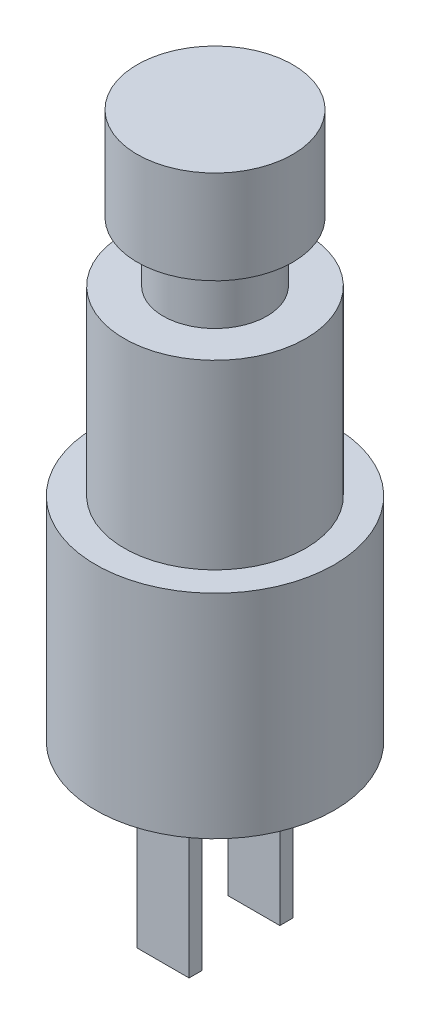
ISO-10303-21;
HEADER;
FILE_DESCRIPTION(('STEP AP214'),'2;1');
FILE_NAME('part.step','',(''),(''),'','','');
FILE_SCHEMA(('AUTOMOTIVE_DESIGN { 1 0 10303 214 1 1 1 1 }'));
ENDSEC;
DATA;
#1=APPLICATION_CONTEXT('core data for automotive mechanical design processes');
#2=APPLICATION_PROTOCOL_DEFINITION('international standard','automotive_design',2000,#1);
#3=PRODUCT_CONTEXT('',#1,'mechanical');
#4=PRODUCT('Part','Part','',(#3));
#5=PRODUCT_RELATED_PRODUCT_CATEGORY('part','',(#4));
#6=PRODUCT_DEFINITION_FORMATION('','',#4);
#7=PRODUCT_DEFINITION_CONTEXT('part definition',#1,'design');
#8=PRODUCT_DEFINITION('design','',#6,#7);
#9=PRODUCT_DEFINITION_SHAPE('','',#8);
#10=(LENGTH_UNIT() NAMED_UNIT(*) SI_UNIT(.MILLI.,.METRE.));
#11=(NAMED_UNIT(*) PLANE_ANGLE_UNIT() SI_UNIT($,.RADIAN.));
#12=(NAMED_UNIT(*) SI_UNIT($,.STERADIAN.) SOLID_ANGLE_UNIT());
#13=UNCERTAINTY_MEASURE_WITH_UNIT(LENGTH_MEASURE(1.E-05),#10,'distance_accuracy_value','');
#14=(GEOMETRIC_REPRESENTATION_CONTEXT(3) GLOBAL_UNCERTAINTY_ASSIGNED_CONTEXT((#13)) GLOBAL_UNIT_ASSIGNED_CONTEXT((#10,
#11,#12)) REPRESENTATION_CONTEXT('',''));
#15=CARTESIAN_POINT('',(0.,0.,0.));
#16=DIRECTION('',(0.,0.,1.));
#17=DIRECTION('',(1.,0.,0.));
#18=AXIS2_PLACEMENT_3D('',#15,#16,#17);
#19=CARTESIAN_POINT('',(4.6,0.,0.));
#20=DIRECTION('',(0.,-1.,0.));
#21=DIRECTION('',(1.,0.,0.));
#22=AXIS2_PLACEMENT_3D('',#19,#20,#21);
#23=PLANE('',#22);
#24=CARTESIAN_POINT('',(0.,0.,0.));
#25=DIRECTION('',(0.,-1.,0.));
#26=DIRECTION('',(1.,0.,0.));
#27=AXIS2_PLACEMENT_3D('',#24,#25,#26);
#28=CIRCLE('',#27,4.6);
#29=CARTESIAN_POINT('',(4.6,0.,0.));
#30=VERTEX_POINT('',#29);
#31=EDGE_CURVE('E156',#30,#30,#28,.T.);
#32=ORIENTED_EDGE('',*,*,#31,.T.);
#33=EDGE_LOOP('',(#32));
#34=FACE_BOUND('',#33,.T.);
#35=DIRECTION('',(0.,0.,1.));
#36=VECTOR('',#35,1.);
#37=CARTESIAN_POINT('',(0.999999999999999,0.,2.));
#38=LINE('',#37,#36);
#39=CARTESIAN_POINT('',(0.999999999999999,0.,1.5));
#40=VERTEX_POINT('',#39);
#41=CARTESIAN_POINT('',(0.999999999999999,0.,2.));
#42=VERTEX_POINT('',#41);
#43=EDGE_CURVE('E128',#40,#42,#38,.T.);
#44=ORIENTED_EDGE('',*,*,#43,.F.);
#45=DIRECTION('',(1.,0.,0.));
#46=VECTOR('',#45,1.);
#47=CARTESIAN_POINT('',(0.999999999999999,0.,1.5));
#48=LINE('',#47,#46);
#49=CARTESIAN_POINT('',(-1.,0.,1.5));
#50=VERTEX_POINT('',#49);
#51=EDGE_CURVE('E125',#50,#40,#48,.T.);
#52=ORIENTED_EDGE('',*,*,#51,.F.);
#53=DIRECTION('',(0.,0.,-1.));
#54=VECTOR('',#53,1.);
#55=CARTESIAN_POINT('',(-1.,0.,1.5));
#56=LINE('',#55,#54);
#57=CARTESIAN_POINT('',(-1.,0.,2.));
#58=VERTEX_POINT('',#57);
#59=EDGE_CURVE('E137',#58,#50,#56,.T.);
#60=ORIENTED_EDGE('',*,*,#59,.F.);
#61=DIRECTION('',(-1.,0.,0.));
#62=VECTOR('',#61,1.);
#63=CARTESIAN_POINT('',(-1.,0.,2.));
#64=LINE('',#63,#62);
#65=EDGE_CURVE('E145',#42,#58,#64,.T.);
#66=ORIENTED_EDGE('',*,*,#65,.F.);
#67=EDGE_LOOP('',(#44,#52,#60,#66));
#68=FACE_BOUND('',#67,.T.);
#69=DIRECTION('',(-1.,0.,0.));
#70=VECTOR('',#69,1.);
#71=CARTESIAN_POINT('',(1.,0.,-1.5));
#72=LINE('',#71,#70);
#73=CARTESIAN_POINT('',(1.,0.,-1.5));
#74=VERTEX_POINT('',#73);
#75=CARTESIAN_POINT('',(-1.,0.,-1.5));
#76=VERTEX_POINT('',#75);
#77=EDGE_CURVE('E202',#74,#76,#72,.T.);
#78=ORIENTED_EDGE('',*,*,#77,.F.);
#79=DIRECTION('',(0.,0.,1.));
#80=VECTOR('',#79,1.);
#81=CARTESIAN_POINT('',(0.999999999999999,0.,-2.));
#82=LINE('',#81,#80);
#83=CARTESIAN_POINT('',(0.999999999999999,0.,-2.));
#84=VERTEX_POINT('',#83);
#85=EDGE_CURVE('E123',#84,#74,#82,.T.);
#86=ORIENTED_EDGE('',*,*,#85,.F.);
#87=DIRECTION('',(1.,0.,0.));
#88=VECTOR('',#87,1.);
#89=CARTESIAN_POINT('',(-1.,0.,-2.));
#90=LINE('',#89,#88);
#91=CARTESIAN_POINT('',(-1.,0.,-2.));
#92=VERTEX_POINT('',#91);
#93=EDGE_CURVE('E119',#92,#84,#90,.T.);
#94=ORIENTED_EDGE('',*,*,#93,.F.);
#95=DIRECTION('',(0.,0.,-1.));
#96=VECTOR('',#95,1.);
#97=CARTESIAN_POINT('',(-1.,0.,-1.5));
#98=LINE('',#97,#96);
#99=EDGE_CURVE('E204',#76,#92,#98,.T.);
#100=ORIENTED_EDGE('',*,*,#99,.F.);
#101=EDGE_LOOP('',(#78,#86,#94,#100));
#102=FACE_BOUND('',#101,.T.);
#103=ADVANCED_FACE('F35',(#34,#68,#102),#23,.T.);
#104=CARTESIAN_POINT('',(0.,21.1,0.));
#105=DIRECTION('',(0.,1.,0.));
#106=DIRECTION('',(-1.,0.,0.));
#107=AXIS2_PLACEMENT_3D('',#104,#105,#106);
#108=PLANE('',#107);
#109=CARTESIAN_POINT('',(0.,21.1,0.));
#110=DIRECTION('',(0.,-1.,0.));
#111=DIRECTION('',(1.,0.,0.));
#112=AXIS2_PLACEMENT_3D('',#109,#110,#111);
#113=CIRCLE('',#112,3.);
#114=CARTESIAN_POINT('',(3.,21.1,0.));
#115=VERTEX_POINT('',#114);
#116=EDGE_CURVE('E11',#115,#115,#113,.T.);
#117=ORIENTED_EDGE('',*,*,#116,.F.);
#118=EDGE_LOOP('',(#117));
#119=FACE_BOUND('',#118,.T.);
#120=ADVANCED_FACE('F181',(#119),#108,.T.);
#121=CARTESIAN_POINT('',(0.,0.,0.));
#122=DIRECTION('',(0.,-1.,0.));
#123=DIRECTION('',(1.,0.,0.));
#124=AXIS2_PLACEMENT_3D('',#121,#122,#123);
#125=CYLINDRICAL_SURFACE('',#124,3.);
#126=ORIENTED_EDGE('',*,*,#116,.T.);
#127=EDGE_LOOP('',(#126));
#128=FACE_BOUND('',#127,.T.);
#129=CARTESIAN_POINT('',(0.,17.5,0.));
#130=DIRECTION('',(0.,-1.,0.));
#131=DIRECTION('',(1.,0.,0.));
#132=AXIS2_PLACEMENT_3D('',#129,#130,#131);
#133=CIRCLE('',#132,3.);
#134=CARTESIAN_POINT('',(3.,17.5,0.));
#135=VERTEX_POINT('',#134);
#136=EDGE_CURVE('E42',#135,#135,#133,.T.);
#137=ORIENTED_EDGE('',*,*,#136,.F.);
#138=EDGE_LOOP('',(#137));
#139=FACE_BOUND('',#138,.T.);
#140=ADVANCED_FACE('F179',(#128,#139),#125,.T.);
#141=CARTESIAN_POINT('',(3.,17.5,0.));
#142=DIRECTION('',(0.,-1.,0.));
#143=DIRECTION('',(1.,0.,0.));
#144=AXIS2_PLACEMENT_3D('',#141,#142,#143);
#145=PLANE('',#144);
#146=ORIENTED_EDGE('',*,*,#136,.T.);
#147=EDGE_LOOP('',(#146));
#148=FACE_BOUND('',#147,.T.);
#149=CARTESIAN_POINT('',(0.,17.5,0.));
#150=DIRECTION('',(0.,-1.,0.));
#151=DIRECTION('',(1.,0.,0.));
#152=AXIS2_PLACEMENT_3D('',#149,#150,#151);
#153=CIRCLE('',#152,2.);
#154=CARTESIAN_POINT('',(2.,17.5,0.));
#155=VERTEX_POINT('',#154);
#156=EDGE_CURVE('E171',#155,#155,#153,.T.);
#157=ORIENTED_EDGE('',*,*,#156,.F.);
#158=EDGE_LOOP('',(#157));
#159=FACE_BOUND('',#158,.T.);
#160=ADVANCED_FACE('F176',(#148,#159),#145,.T.);
#161=CARTESIAN_POINT('',(0.,0.,0.));
#162=DIRECTION('',(0.,-1.,0.));
#163=DIRECTION('',(1.,0.,0.));
#164=AXIS2_PLACEMENT_3D('',#161,#162,#163);
#165=CYLINDRICAL_SURFACE('',#164,2.);
#166=ORIENTED_EDGE('',*,*,#156,.T.);
#167=EDGE_LOOP('',(#166));
#168=FACE_BOUND('',#167,.T.);
#169=CARTESIAN_POINT('',(0.,15.2,0.));
#170=DIRECTION('',(0.,-1.,0.));
#171=DIRECTION('',(1.,0.,0.));
#172=AXIS2_PLACEMENT_3D('',#169,#170,#171);
#173=CIRCLE('',#172,2.);
#174=CARTESIAN_POINT('',(2.,15.2,0.));
#175=VERTEX_POINT('',#174);
#176=EDGE_CURVE('E168',#175,#175,#173,.T.);
#177=ORIENTED_EDGE('',*,*,#176,.F.);
#178=EDGE_LOOP('',(#177));
#179=FACE_BOUND('',#178,.T.);
#180=ADVANCED_FACE('F188',(#168,#179),#165,.T.);
#181=CARTESIAN_POINT('',(2.,15.2,0.));
#182=DIRECTION('',(0.,1.,0.));
#183=DIRECTION('',(-1.,0.,0.));
#184=AXIS2_PLACEMENT_3D('',#181,#182,#183);
#185=PLANE('',#184);
#186=ORIENTED_EDGE('',*,*,#176,.T.);
#187=EDGE_LOOP('',(#186));
#188=FACE_BOUND('',#187,.T.);
#189=CARTESIAN_POINT('',(0.,15.2,0.));
#190=DIRECTION('',(0.,-1.,0.));
#191=DIRECTION('',(1.,0.,0.));
#192=AXIS2_PLACEMENT_3D('',#189,#190,#191);
#193=CIRCLE('',#192,3.5);
#194=CARTESIAN_POINT('',(3.5,15.2,0.));
#195=VERTEX_POINT('',#194);
#196=EDGE_CURVE('E165',#195,#195,#193,.T.);
#197=ORIENTED_EDGE('',*,*,#196,.F.);
#198=EDGE_LOOP('',(#197));
#199=FACE_BOUND('',#198,.T.);
#200=ADVANCED_FACE('F259',(#188,#199),#185,.T.);
#201=CARTESIAN_POINT('',(0.,0.,0.));
#202=DIRECTION('',(0.,-1.,0.));
#203=DIRECTION('',(1.,0.,0.));
#204=AXIS2_PLACEMENT_3D('',#201,#202,#203);
#205=CYLINDRICAL_SURFACE('',#204,3.5);
#206=ORIENTED_EDGE('',*,*,#196,.T.);
#207=EDGE_LOOP('',(#206));
#208=FACE_BOUND('',#207,.T.);
#209=CARTESIAN_POINT('',(0.,8.2,0.));
#210=DIRECTION('',(0.,-1.,0.));
#211=DIRECTION('',(1.,0.,0.));
#212=AXIS2_PLACEMENT_3D('',#209,#210,#211);
#213=CIRCLE('',#212,3.5);
#214=CARTESIAN_POINT('',(3.5,8.2,0.));
#215=VERTEX_POINT('',#214);
#216=EDGE_CURVE('E162',#215,#215,#213,.T.);
#217=ORIENTED_EDGE('',*,*,#216,.F.);
#218=EDGE_LOOP('',(#217));
#219=FACE_BOUND('',#218,.T.);
#220=ADVANCED_FACE('F255',(#208,#219),#205,.T.);
#221=CARTESIAN_POINT('',(3.5,8.2,0.));
#222=DIRECTION('',(0.,1.,0.));
#223=DIRECTION('',(-1.,0.,0.));
#224=AXIS2_PLACEMENT_3D('',#221,#222,#223);
#225=PLANE('',#224);
#226=ORIENTED_EDGE('',*,*,#216,.T.);
#227=EDGE_LOOP('',(#226));
#228=FACE_BOUND('',#227,.T.);
#229=CARTESIAN_POINT('',(0.,8.2,0.));
#230=DIRECTION('',(0.,-1.,0.));
#231=DIRECTION('',(1.,0.,0.));
#232=AXIS2_PLACEMENT_3D('',#229,#230,#231);
#233=CIRCLE('',#232,4.6);
#234=CARTESIAN_POINT('',(4.6,8.2,0.));
#235=VERTEX_POINT('',#234);
#236=EDGE_CURVE('E159',#235,#235,#233,.T.);
#237=ORIENTED_EDGE('',*,*,#236,.F.);
#238=EDGE_LOOP('',(#237));
#239=FACE_BOUND('',#238,.T.);
#240=ADVANCED_FACE('F251',(#228,#239),#225,.T.);
#241=CARTESIAN_POINT('',(0.,0.,0.));
#242=DIRECTION('',(0.,-1.,0.));
#243=DIRECTION('',(1.,0.,0.));
#244=AXIS2_PLACEMENT_3D('',#241,#242,#243);
#245=CYLINDRICAL_SURFACE('',#244,4.6);
#246=ORIENTED_EDGE('',*,*,#236,.T.);
#247=EDGE_LOOP('',(#246));
#248=FACE_BOUND('',#247,.T.);
#249=ORIENTED_EDGE('',*,*,#31,.F.);
#250=EDGE_LOOP('',(#249));
#251=FACE_BOUND('',#250,.T.);
#252=ADVANCED_FACE('F247',(#248,#251),#245,.T.);
#253=CARTESIAN_POINT('',(0.999999999999999,-6.4,1.5));
#254=DIRECTION('',(0.,0.,1.));
#255=DIRECTION('',(1.,0.,0.));
#256=AXIS2_PLACEMENT_3D('',#253,#254,#255);
#257=PLANE('',#256);
#258=ORIENTED_EDGE('',*,*,#51,.T.);
#259=DIRECTION('',(0.,1.,0.));
#260=VECTOR('',#259,1.);
#261=CARTESIAN_POINT('',(0.999999999999999,-6.4,1.5));
#262=LINE('',#261,#260);
#263=CARTESIAN_POINT('',(0.999999999999999,-6.4,1.5));
#264=VERTEX_POINT('',#263);
#265=EDGE_CURVE('E154',#264,#40,#262,.T.);
#266=ORIENTED_EDGE('',*,*,#265,.F.);
#267=DIRECTION('',(1.,0.,0.));
#268=VECTOR('',#267,1.);
#269=CARTESIAN_POINT('',(0.999999999999999,-6.4,1.5));
#270=LINE('',#269,#268);
#271=CARTESIAN_POINT('',(-1.,-6.4,1.5));
#272=VERTEX_POINT('',#271);
#273=EDGE_CURVE('E133',#272,#264,#270,.T.);
#274=ORIENTED_EDGE('',*,*,#273,.F.);
#275=DIRECTION('',(0.,1.,0.));
#276=VECTOR('',#275,1.);
#277=CARTESIAN_POINT('',(-1.,-6.4,1.5));
#278=LINE('',#277,#276);
#279=EDGE_CURVE('E142',#272,#50,#278,.T.);
#280=ORIENTED_EDGE('',*,*,#279,.T.);
#281=EDGE_LOOP('',(#258,#266,#274,#280));
#282=FACE_BOUND('',#281,.T.);
#283=ADVANCED_FACE('F243',(#282),#257,.F.);
#284=CARTESIAN_POINT('',(0.999999999999998,-6.4,2.));
#285=DIRECTION('',(-1.,0.,0.));
#286=DIRECTION('',(0.,0.,1.));
#287=AXIS2_PLACEMENT_3D('',#284,#285,#286);
#288=PLANE('',#287);
#289=ORIENTED_EDGE('',*,*,#43,.T.);
#290=DIRECTION('',(0.,1.,0.));
#291=VECTOR('',#290,1.);
#292=CARTESIAN_POINT('',(0.999999999999998,-6.4,2.));
#293=LINE('',#292,#291);
#294=CARTESIAN_POINT('',(0.999999999999998,-6.4,2.));
#295=VERTEX_POINT('',#294);
#296=EDGE_CURVE('E151',#295,#42,#293,.T.);
#297=ORIENTED_EDGE('',*,*,#296,.F.);
#298=DIRECTION('',(0.,0.,1.));
#299=VECTOR('',#298,1.);
#300=CARTESIAN_POINT('',(0.999999999999998,-6.4,2.));
#301=LINE('',#300,#299);
#302=EDGE_CURVE('E136',#264,#295,#301,.T.);
#303=ORIENTED_EDGE('',*,*,#302,.F.);
#304=ORIENTED_EDGE('',*,*,#265,.T.);
#305=EDGE_LOOP('',(#289,#297,#303,#304));
#306=FACE_BOUND('',#305,.T.);
#307=ADVANCED_FACE('F239',(#306),#288,.F.);
#308=CARTESIAN_POINT('',(-1.,-6.4,2.));
#309=DIRECTION('',(0.,0.,-1.));
#310=DIRECTION('',(-1.,0.,0.));
#311=AXIS2_PLACEMENT_3D('',#308,#309,#310);
#312=PLANE('',#311);
#313=ORIENTED_EDGE('',*,*,#65,.T.);
#314=DIRECTION('',(0.,1.,0.));
#315=VECTOR('',#314,1.);
#316=CARTESIAN_POINT('',(-1.,-6.4,2.));
#317=LINE('',#316,#315);
#318=CARTESIAN_POINT('',(-1.,-6.4,2.));
#319=VERTEX_POINT('',#318);
#320=EDGE_CURVE('E57',#319,#58,#317,.T.);
#321=ORIENTED_EDGE('',*,*,#320,.F.);
#322=DIRECTION('',(-1.,0.,0.));
#323=VECTOR('',#322,1.);
#324=CARTESIAN_POINT('',(-1.,-6.4,2.));
#325=LINE('',#324,#323);
#326=EDGE_CURVE('E139',#295,#319,#325,.T.);
#327=ORIENTED_EDGE('',*,*,#326,.F.);
#328=ORIENTED_EDGE('',*,*,#296,.T.);
#329=EDGE_LOOP('',(#313,#321,#327,#328));
#330=FACE_BOUND('',#329,.T.);
#331=ADVANCED_FACE('F236',(#330),#312,.F.);
#332=CARTESIAN_POINT('',(-1.,-6.4,1.5));
#333=DIRECTION('',(1.,0.,0.));
#334=DIRECTION('',(0.,0.,-1.));
#335=AXIS2_PLACEMENT_3D('',#332,#333,#334);
#336=PLANE('',#335);
#337=ORIENTED_EDGE('',*,*,#59,.T.);
#338=ORIENTED_EDGE('',*,*,#279,.F.);
#339=DIRECTION('',(0.,0.,-1.));
#340=VECTOR('',#339,1.);
#341=CARTESIAN_POINT('',(-1.,-6.4,1.5));
#342=LINE('',#341,#340);
#343=EDGE_CURVE('E141',#319,#272,#342,.T.);
#344=ORIENTED_EDGE('',*,*,#343,.F.);
#345=ORIENTED_EDGE('',*,*,#320,.T.);
#346=EDGE_LOOP('',(#337,#338,#344,#345));
#347=FACE_BOUND('',#346,.T.);
#348=ADVANCED_FACE('F232',(#347),#336,.F.);
#349=CARTESIAN_POINT('',(0.,-6.4,0.));
#350=DIRECTION('',(0.,1.,0.));
#351=DIRECTION('',(-1.,0.,0.));
#352=AXIS2_PLACEMENT_3D('',#349,#350,#351);
#353=PLANE('',#352);
#354=ORIENTED_EDGE('',*,*,#273,.T.);
#355=ORIENTED_EDGE('',*,*,#302,.T.);
#356=ORIENTED_EDGE('',*,*,#326,.T.);
#357=ORIENTED_EDGE('',*,*,#343,.T.);
#358=EDGE_LOOP('',(#354,#355,#356,#357));
#359=FACE_BOUND('',#358,.T.);
#360=ADVANCED_FACE('F229',(#359),#353,.F.);
#361=CARTESIAN_POINT('',(0.999999999999999,-6.4,-2.));
#362=DIRECTION('',(-1.,0.,0.));
#363=DIRECTION('',(0.,0.,1.));
#364=AXIS2_PLACEMENT_3D('',#361,#362,#363);
#365=PLANE('',#364);
#366=ORIENTED_EDGE('',*,*,#85,.T.);
#367=DIRECTION('',(0.,1.,0.));
#368=VECTOR('',#367,1.);
#369=CARTESIAN_POINT('',(0.999999999999999,-6.4,-1.5));
#370=LINE('',#369,#368);
#371=CARTESIAN_POINT('',(0.999999999999999,-6.4,-1.5));
#372=VERTEX_POINT('',#371);
#373=EDGE_CURVE('E104',#372,#74,#370,.T.);
#374=ORIENTED_EDGE('',*,*,#373,.F.);
#375=DIRECTION('',(0.,0.,1.));
#376=VECTOR('',#375,1.);
#377=CARTESIAN_POINT('',(0.999999999999999,-6.4,-2.));
#378=LINE('',#377,#376);
#379=CARTESIAN_POINT('',(0.999999999999999,-6.4,-2.));
#380=VERTEX_POINT('',#379);
#381=EDGE_CURVE('E111',#380,#372,#378,.T.);
#382=ORIENTED_EDGE('',*,*,#381,.F.);
#383=DIRECTION('',(0.,1.,0.));
#384=VECTOR('',#383,1.);
#385=CARTESIAN_POINT('',(0.999999999999999,-6.4,-2.));
#386=LINE('',#385,#384);
#387=EDGE_CURVE('E211',#380,#84,#386,.T.);
#388=ORIENTED_EDGE('',*,*,#387,.T.);
#389=EDGE_LOOP('',(#366,#374,#382,#388));
#390=FACE_BOUND('',#389,.T.);
#391=ADVANCED_FACE('F121',(#390),#365,.F.);
#392=CARTESIAN_POINT('',(0.999999999999999,-6.4,-1.5));
#393=DIRECTION('',(0.,0.,-1.));
#394=DIRECTION('',(-1.,0.,0.));
#395=AXIS2_PLACEMENT_3D('',#392,#393,#394);
#396=PLANE('',#395);
#397=ORIENTED_EDGE('',*,*,#77,.T.);
#398=DIRECTION('',(0.,1.,0.));
#399=VECTOR('',#398,1.);
#400=CARTESIAN_POINT('',(-1.,-6.4,-1.5));
#401=LINE('',#400,#399);
#402=CARTESIAN_POINT('',(-1.,-6.4,-1.5));
#403=VERTEX_POINT('',#402);
#404=EDGE_CURVE('E107',#403,#76,#401,.T.);
#405=ORIENTED_EDGE('',*,*,#404,.F.);
#406=DIRECTION('',(-1.,0.,0.));
#407=VECTOR('',#406,1.);
#408=CARTESIAN_POINT('',(0.999999999999999,-6.4,-1.5));
#409=LINE('',#408,#407);
#410=EDGE_CURVE('E100',#372,#403,#409,.T.);
#411=ORIENTED_EDGE('',*,*,#410,.F.);
#412=ORIENTED_EDGE('',*,*,#373,.T.);
#413=EDGE_LOOP('',(#397,#405,#411,#412));
#414=FACE_BOUND('',#413,.T.);
#415=ADVANCED_FACE('F102',(#414),#396,.F.);
#416=CARTESIAN_POINT('',(-1.,-6.4,-1.5));
#417=DIRECTION('',(1.,0.,0.));
#418=DIRECTION('',(0.,0.,-1.));
#419=AXIS2_PLACEMENT_3D('',#416,#417,#418);
#420=PLANE('',#419);
#421=ORIENTED_EDGE('',*,*,#99,.T.);
#422=DIRECTION('',(0.,1.,0.));
#423=VECTOR('',#422,1.);
#424=CARTESIAN_POINT('',(-1.,-6.4,-2.));
#425=LINE('',#424,#423);
#426=CARTESIAN_POINT('',(-1.,-6.4,-2.));
#427=VERTEX_POINT('',#426);
#428=EDGE_CURVE('E49',#427,#92,#425,.T.);
#429=ORIENTED_EDGE('',*,*,#428,.F.);
#430=DIRECTION('',(0.,0.,-1.));
#431=VECTOR('',#430,1.);
#432=CARTESIAN_POINT('',(-1.,-6.4,-1.5));
#433=LINE('',#432,#431);
#434=EDGE_CURVE('E110',#403,#427,#433,.T.);
#435=ORIENTED_EDGE('',*,*,#434,.F.);
#436=ORIENTED_EDGE('',*,*,#404,.T.);
#437=EDGE_LOOP('',(#421,#429,#435,#436));
#438=FACE_BOUND('',#437,.T.);
#439=ADVANCED_FACE('F214',(#438),#420,.F.);
#440=CARTESIAN_POINT('',(-1.,-6.4,-2.));
#441=DIRECTION('',(0.,0.,1.));
#442=DIRECTION('',(1.,0.,0.));
#443=AXIS2_PLACEMENT_3D('',#440,#441,#442);
#444=PLANE('',#443);
#445=ORIENTED_EDGE('',*,*,#93,.T.);
#446=ORIENTED_EDGE('',*,*,#387,.F.);
#447=DIRECTION('',(1.,0.,0.));
#448=VECTOR('',#447,1.);
#449=CARTESIAN_POINT('',(-1.,-6.4,-2.));
#450=LINE('',#449,#448);
#451=EDGE_CURVE('E115',#427,#380,#450,.T.);
#452=ORIENTED_EDGE('',*,*,#451,.F.);
#453=ORIENTED_EDGE('',*,*,#428,.T.);
#454=EDGE_LOOP('',(#445,#446,#452,#453));
#455=FACE_BOUND('',#454,.T.);
#456=ADVANCED_FACE('F215',(#455),#444,.F.);
#457=CARTESIAN_POINT('',(0.,-6.4,0.));
#458=DIRECTION('',(0.,-1.,0.));
#459=DIRECTION('',(1.,0.,0.));
#460=AXIS2_PLACEMENT_3D('',#457,#458,#459);
#461=PLANE('',#460);
#462=ORIENTED_EDGE('',*,*,#381,.T.);
#463=ORIENTED_EDGE('',*,*,#410,.T.);
#464=ORIENTED_EDGE('',*,*,#434,.T.);
#465=ORIENTED_EDGE('',*,*,#451,.T.);
#466=EDGE_LOOP('',(#462,#463,#464,#465));
#467=FACE_BOUND('',#466,.T.);
#468=ADVANCED_FACE('F114',(#467),#461,.T.);
#469=CLOSED_SHELL('',(#103,#120,#140,#160,#180,#200,#220,#240,#252,#283,#307,#331,#348,#360,
#391,#415,#439,#456,#468));
#470=MANIFOLD_SOLID_BREP('B2',#469);
#471=ADVANCED_BREP_SHAPE_REPRESENTATION('',(#18,#470),#14);
#472=SHAPE_DEFINITION_REPRESENTATION(#9,#471);
ENDSEC;
END-ISO-10303-21;
